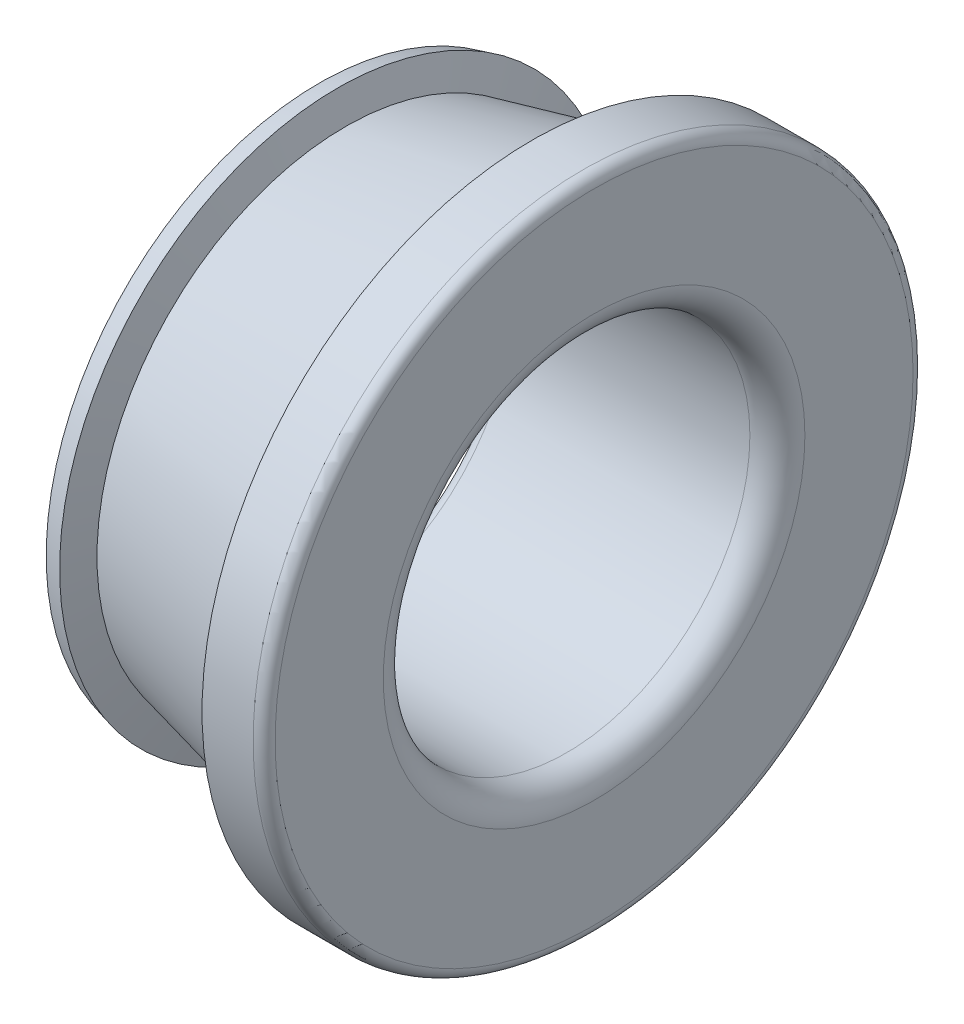
ISO-10303-21;
HEADER;
FILE_DESCRIPTION(('STEP AP214'),'2;1');
FILE_NAME('part.step','',(''),(''),'','','');
FILE_SCHEMA(('AUTOMOTIVE_DESIGN { 1 0 10303 214 1 1 1 1 }'));
ENDSEC;
DATA;
#1=APPLICATION_CONTEXT('core data for automotive mechanical design processes');
#2=APPLICATION_PROTOCOL_DEFINITION('international standard','automotive_design',2000,#1);
#3=PRODUCT_CONTEXT('',#1,'mechanical');
#4=PRODUCT('Part','Part','',(#3));
#5=PRODUCT_RELATED_PRODUCT_CATEGORY('part','',(#4));
#6=PRODUCT_DEFINITION_FORMATION('','',#4);
#7=PRODUCT_DEFINITION_CONTEXT('part definition',#1,'design');
#8=PRODUCT_DEFINITION('design','',#6,#7);
#9=PRODUCT_DEFINITION_SHAPE('','',#8);
#10=(LENGTH_UNIT() NAMED_UNIT(*) SI_UNIT(.MILLI.,.METRE.));
#11=(NAMED_UNIT(*) PLANE_ANGLE_UNIT() SI_UNIT($,.RADIAN.));
#12=(NAMED_UNIT(*) SI_UNIT($,.STERADIAN.) SOLID_ANGLE_UNIT());
#13=UNCERTAINTY_MEASURE_WITH_UNIT(LENGTH_MEASURE(1.E-05),#10,'distance_accuracy_value','');
#14=(GEOMETRIC_REPRESENTATION_CONTEXT(3) GLOBAL_UNCERTAINTY_ASSIGNED_CONTEXT((#13)) GLOBAL_UNIT_ASSIGNED_CONTEXT((#10,
#11,#12)) REPRESENTATION_CONTEXT('',''));
#15=CARTESIAN_POINT('',(0.,0.,0.));
#16=DIRECTION('',(0.,0.,1.));
#17=DIRECTION('',(1.,0.,0.));
#18=AXIS2_PLACEMENT_3D('',#15,#16,#17);
#19=CARTESIAN_POINT('',(-1.5,0.,0.));
#20=DIRECTION('',(1.,0.,0.));
#21=DIRECTION('',(0.,0.,-1.));
#22=AXIS2_PLACEMENT_3D('',#19,#20,#21);
#23=TOROIDAL_SURFACE('',#22,11.5,1.5);
#24=CARTESIAN_POINT('',(0.,0.,0.));
#25=DIRECTION('',(1.,0.,0.));
#26=DIRECTION('',(0.,0.,-1.));
#27=AXIS2_PLACEMENT_3D('',#24,#25,#26);
#28=CIRCLE('',#27,11.5);
#29=CARTESIAN_POINT('',(0.,0.,-11.5));
#30=VERTEX_POINT('',#29);
#31=EDGE_CURVE('E68',#30,#30,#28,.T.);
#32=ORIENTED_EDGE('',*,*,#31,.T.);
#33=EDGE_LOOP('',(#32));
#34=FACE_BOUND('',#33,.T.);
#35=CARTESIAN_POINT('',(-1.5,0.,0.));
#36=DIRECTION('',(1.,0.,0.));
#37=DIRECTION('',(0.,0.,-1.));
#38=AXIS2_PLACEMENT_3D('',#35,#36,#37);
#39=CIRCLE('',#38,10.);
#40=CARTESIAN_POINT('',(-1.5,0.,-10.));
#41=VERTEX_POINT('',#40);
#42=EDGE_CURVE('E10',#41,#41,#39,.T.);
#43=ORIENTED_EDGE('',*,*,#42,.F.);
#44=EDGE_LOOP('',(#43));
#45=FACE_BOUND('',#44,.T.);
#46=ADVANCED_FACE('F31',(#34,#45),#23,.T.);
#47=CARTESIAN_POINT('',(0.,0.,0.));
#48=DIRECTION('',(1.,0.,0.));
#49=DIRECTION('',(0.,0.,-1.));
#50=AXIS2_PLACEMENT_3D('',#47,#48,#49);
#51=CYLINDRICAL_SURFACE('',#50,10.);
#52=ORIENTED_EDGE('',*,*,#42,.T.);
#53=EDGE_LOOP('',(#52));
#54=FACE_BOUND('',#53,.T.);
#55=CARTESIAN_POINT('',(-14.4,0.,0.));
#56=DIRECTION('',(1.,0.,0.));
#57=DIRECTION('',(0.,0.,-1.));
#58=AXIS2_PLACEMENT_3D('',#55,#56,#57);
#59=CIRCLE('',#58,10.);
#60=CARTESIAN_POINT('',(-14.4,0.,-10.));
#61=VERTEX_POINT('',#60);
#62=EDGE_CURVE('E37',#61,#61,#59,.T.);
#63=ORIENTED_EDGE('',*,*,#62,.F.);
#64=EDGE_LOOP('',(#63));
#65=FACE_BOUND('',#64,.T.);
#66=ADVANCED_FACE('F86',(#54,#65),#51,.F.);
#67=CARTESIAN_POINT('',(-14.4,0.,0.));
#68=DIRECTION('',(1.,0.,0.));
#69=DIRECTION('',(0.,0.,-1.));
#70=AXIS2_PLACEMENT_3D('',#67,#68,#69);
#71=TOROIDAL_SURFACE('',#70,10.6,0.6);
#72=ORIENTED_EDGE('',*,*,#62,.T.);
#73=EDGE_LOOP('',(#72));
#74=FACE_BOUND('',#73,.T.);
#75=CARTESIAN_POINT('',(-15.,0.,0.));
#76=DIRECTION('',(1.,0.,0.));
#77=DIRECTION('',(0.,0.,-1.));
#78=AXIS2_PLACEMENT_3D('',#75,#76,#77);
#79=CIRCLE('',#78,10.6);
#80=CARTESIAN_POINT('',(-15.,0.,-10.6));
#81=VERTEX_POINT('',#80);
#82=EDGE_CURVE('E41',#81,#81,#79,.T.);
#83=ORIENTED_EDGE('',*,*,#82,.F.);
#84=EDGE_LOOP('',(#83));
#85=FACE_BOUND('',#84,.T.);
#86=ADVANCED_FACE('F90',(#74,#85),#71,.T.);
#87=CARTESIAN_POINT('',(-15.,10.6,0.));
#88=DIRECTION('',(-1.,0.,0.));
#89=DIRECTION('',(0.,0.,1.));
#90=AXIS2_PLACEMENT_3D('',#87,#88,#89);
#91=PLANE('',#90);
#92=ORIENTED_EDGE('',*,*,#82,.T.);
#93=EDGE_LOOP('',(#92));
#94=FACE_BOUND('',#93,.T.);
#95=CARTESIAN_POINT('',(-15.,0.,0.));
#96=DIRECTION('',(1.,0.,0.));
#97=DIRECTION('',(0.,0.,-1.));
#98=AXIS2_PLACEMENT_3D('',#95,#96,#97);
#99=CIRCLE('',#98,14.8879441906845);
#100=CARTESIAN_POINT('',(-15.,0.,-14.8879441906845));
#101=VERTEX_POINT('',#100);
#102=EDGE_CURVE('E45',#101,#101,#99,.T.);
#103=ORIENTED_EDGE('',*,*,#102,.F.);
#104=EDGE_LOOP('',(#103));
#105=FACE_BOUND('',#104,.T.);
#106=ADVANCED_FACE('F94',(#94,#105),#91,.T.);
#107=CARTESIAN_POINT('',(-14.,0.,0.));
#108=DIRECTION('',(1.,0.,0.));
#109=DIRECTION('',(0.,0.,-1.));
#110=AXIS2_PLACEMENT_3D('',#107,#108,#109);
#111=CONICAL_SURFACE('',#110,15.1558933831156,0.261799387799144);
#112=ORIENTED_EDGE('',*,*,#102,.T.);
#113=EDGE_LOOP('',(#112));
#114=FACE_BOUND('',#113,.T.);
#115=CARTESIAN_POINT('',(-14.,0.,0.));
#116=DIRECTION('',(1.,0.,0.));
#117=DIRECTION('',(0.,0.,-1.));
#118=AXIS2_PLACEMENT_3D('',#115,#116,#117);
#119=CIRCLE('',#118,15.1558933831156);
#120=CARTESIAN_POINT('',(-14.,0.,-15.1558933831156));
#121=VERTEX_POINT('',#120);
#122=EDGE_CURVE('E50',#121,#121,#119,.T.);
#123=ORIENTED_EDGE('',*,*,#122,.F.);
#124=EDGE_LOOP('',(#123));
#125=FACE_BOUND('',#124,.T.);
#126=ADVANCED_FACE('F100',(#114,#125),#111,.T.);
#127=CARTESIAN_POINT('',(-13.5692572260566,0.,0.));
#128=DIRECTION('',(-1.,0.,0.));
#129=DIRECTION('',(0.,0.,1.));
#130=AXIS2_PLACEMENT_3D('',#127,#128,#129);
#131=CONICAL_SURFACE('',#130,13.5483394657656,1.30899693899575);
#132=ORIENTED_EDGE('',*,*,#122,.T.);
#133=EDGE_LOOP('',(#132));
#134=FACE_BOUND('',#133,.T.);
#135=CARTESIAN_POINT('',(-13.5692572260566,0.,0.));
#136=DIRECTION('',(1.,0.,0.));
#137=DIRECTION('',(0.,0.,-1.));
#138=AXIS2_PLACEMENT_3D('',#135,#136,#137);
#139=CIRCLE('',#138,13.5483394657656);
#140=CARTESIAN_POINT('',(-13.5692572260566,0.,-13.5483394657656));
#141=VERTEX_POINT('',#140);
#142=EDGE_CURVE('E53',#141,#141,#139,.T.);
#143=ORIENTED_EDGE('',*,*,#142,.F.);
#144=EDGE_LOOP('',(#143));
#145=FACE_BOUND('',#144,.T.);
#146=ADVANCED_FACE('F104',(#134,#145),#131,.T.);
#147=CARTESIAN_POINT('',(-2.86801151343943,0.,0.));
#148=DIRECTION('',(1.,0.,0.));
#149=DIRECTION('',(0.,0.,-1.));
#150=AXIS2_PLACEMENT_3D('',#147,#148,#149);
#151=CONICAL_SURFACE('',#150,16.0681483474219,0.23125612588925);
#152=ORIENTED_EDGE('',*,*,#142,.T.);
#153=EDGE_LOOP('',(#152));
#154=FACE_BOUND('',#153,.T.);
#155=CARTESIAN_POINT('',(-2.86801151343943,0.,0.));
#156=DIRECTION('',(1.,0.,0.));
#157=DIRECTION('',(0.,0.,-1.));
#158=AXIS2_PLACEMENT_3D('',#155,#156,#157);
#159=CIRCLE('',#158,16.0681483474219);
#160=CARTESIAN_POINT('',(-2.86801151343943,0.,-16.0681483474219));
#161=VERTEX_POINT('',#160);
#162=EDGE_CURVE('E56',#161,#161,#159,.T.);
#163=ORIENTED_EDGE('',*,*,#162,.F.);
#164=EDGE_LOOP('',(#163));
#165=FACE_BOUND('',#164,.T.);
#166=ADVANCED_FACE('F108',(#154,#165),#151,.T.);
#167=CARTESIAN_POINT('',(-3.38564960364446,0.,0.));
#168=DIRECTION('',(-1.,0.,0.));
#169=DIRECTION('',(0.,0.,1.));
#170=AXIS2_PLACEMENT_3D('',#167,#168,#169);
#171=CONICAL_SURFACE('',#170,18.,1.30899693899575);
#172=ORIENTED_EDGE('',*,*,#162,.T.);
#173=EDGE_LOOP('',(#172));
#174=FACE_BOUND('',#173,.T.);
#175=CARTESIAN_POINT('',(-3.38564960364446,0.,0.));
#176=DIRECTION('',(1.,0.,0.));
#177=DIRECTION('',(0.,0.,-1.));
#178=AXIS2_PLACEMENT_3D('',#175,#176,#177);
#179=CIRCLE('',#178,18.);
#180=CARTESIAN_POINT('',(-3.38564960364446,0.,-18.));
#181=VERTEX_POINT('',#180);
#182=EDGE_CURVE('E59',#181,#181,#179,.T.);
#183=ORIENTED_EDGE('',*,*,#182,.F.);
#184=EDGE_LOOP('',(#183));
#185=FACE_BOUND('',#184,.T.);
#186=ADVANCED_FACE('F112',(#174,#185),#171,.F.);
#187=CARTESIAN_POINT('',(0.,0.,0.));
#188=DIRECTION('',(1.,0.,0.));
#189=DIRECTION('',(0.,0.,-1.));
#190=AXIS2_PLACEMENT_3D('',#187,#188,#189);
#191=CYLINDRICAL_SURFACE('',#190,18.);
#192=ORIENTED_EDGE('',*,*,#182,.T.);
#193=EDGE_LOOP('',(#192));
#194=FACE_BOUND('',#193,.T.);
#195=CARTESIAN_POINT('',(-0.6,0.,0.));
#196=DIRECTION('',(1.,0.,0.));
#197=DIRECTION('',(0.,0.,-1.));
#198=AXIS2_PLACEMENT_3D('',#195,#196,#197);
#199=CIRCLE('',#198,18.);
#200=CARTESIAN_POINT('',(-0.6,0.,-18.));
#201=VERTEX_POINT('',#200);
#202=EDGE_CURVE('E62',#201,#201,#199,.T.);
#203=ORIENTED_EDGE('',*,*,#202,.F.);
#204=EDGE_LOOP('',(#203));
#205=FACE_BOUND('',#204,.T.);
#206=ADVANCED_FACE('F82',(#194,#205),#191,.T.);
#207=CARTESIAN_POINT('',(-0.6,0.,0.));
#208=DIRECTION('',(1.,0.,0.));
#209=DIRECTION('',(0.,0.,-1.));
#210=AXIS2_PLACEMENT_3D('',#207,#208,#209);
#211=TOROIDAL_SURFACE('',#210,17.4,0.6);
#212=ORIENTED_EDGE('',*,*,#202,.T.);
#213=EDGE_LOOP('',(#212));
#214=FACE_BOUND('',#213,.T.);
#215=CARTESIAN_POINT('',(0.,0.,0.));
#216=DIRECTION('',(1.,0.,0.));
#217=DIRECTION('',(0.,0.,-1.));
#218=AXIS2_PLACEMENT_3D('',#215,#216,#217);
#219=CIRCLE('',#218,17.4);
#220=CARTESIAN_POINT('',(0.,0.,-17.4));
#221=VERTEX_POINT('',#220);
#222=EDGE_CURVE('E65',#221,#221,#219,.T.);
#223=ORIENTED_EDGE('',*,*,#222,.F.);
#224=EDGE_LOOP('',(#223));
#225=FACE_BOUND('',#224,.T.);
#226=ADVANCED_FACE('F76',(#214,#225),#211,.T.);
#227=CARTESIAN_POINT('',(0.,11.5,0.));
#228=DIRECTION('',(1.,0.,0.));
#229=DIRECTION('',(0.,0.,-1.));
#230=AXIS2_PLACEMENT_3D('',#227,#228,#229);
#231=PLANE('',#230);
#232=ORIENTED_EDGE('',*,*,#222,.T.);
#233=EDGE_LOOP('',(#232));
#234=FACE_BOUND('',#233,.T.);
#235=ORIENTED_EDGE('',*,*,#31,.F.);
#236=EDGE_LOOP('',(#235));
#237=FACE_BOUND('',#236,.T.);
#238=ADVANCED_FACE('F74',(#234,#237),#231,.T.);
#239=CLOSED_SHELL('',(#46,#66,#86,#106,#126,#146,#166,#186,#206,#226,#238));
#240=MANIFOLD_SOLID_BREP('B2',#239);
#241=ADVANCED_BREP_SHAPE_REPRESENTATION('',(#18,#240),#14);
#242=SHAPE_DEFINITION_REPRESENTATION(#9,#241);
ENDSEC;
END-ISO-10303-21;
